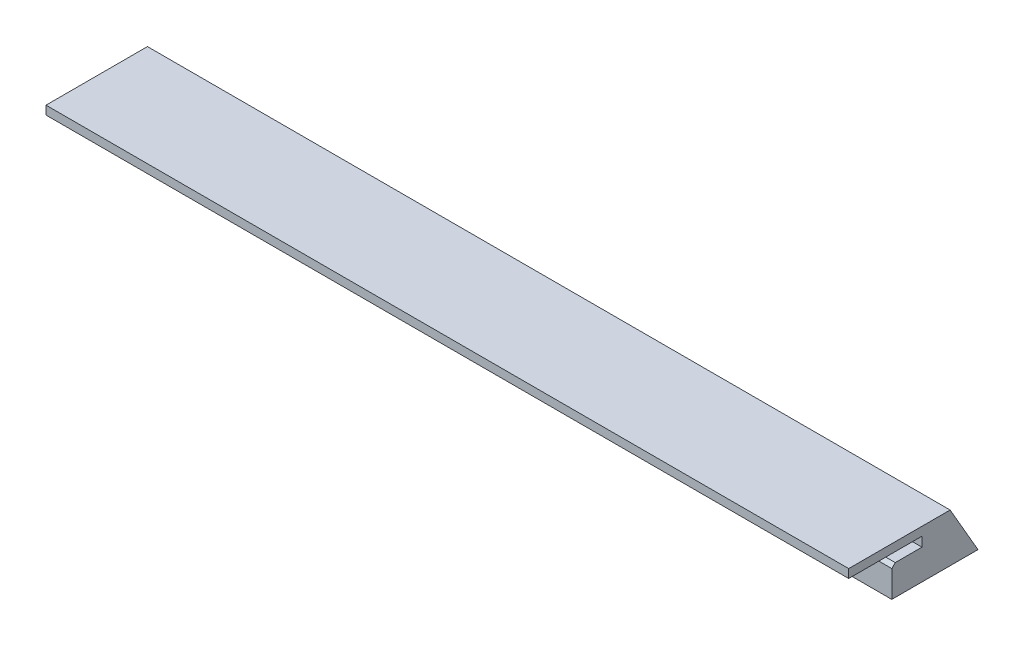
ISO-10303-21;
HEADER;
FILE_DESCRIPTION(('STEP AP214'),'2;1');
FILE_NAME('part.step','',(''),(''),'','','');
FILE_SCHEMA(('AUTOMOTIVE_DESIGN { 1 0 10303 214 1 1 1 1 }'));
ENDSEC;
DATA;
#1=APPLICATION_CONTEXT('core data for automotive mechanical design processes');
#2=APPLICATION_PROTOCOL_DEFINITION('international standard','automotive_design',2000,#1);
#3=PRODUCT_CONTEXT('',#1,'mechanical');
#4=PRODUCT('Part','Part','',(#3));
#5=PRODUCT_RELATED_PRODUCT_CATEGORY('part','',(#4));
#6=PRODUCT_DEFINITION_FORMATION('','',#4);
#7=PRODUCT_DEFINITION_CONTEXT('part definition',#1,'design');
#8=PRODUCT_DEFINITION('design','',#6,#7);
#9=PRODUCT_DEFINITION_SHAPE('','',#8);
#10=(LENGTH_UNIT() NAMED_UNIT(*) SI_UNIT(.MILLI.,.METRE.));
#11=(NAMED_UNIT(*) PLANE_ANGLE_UNIT() SI_UNIT($,.RADIAN.));
#12=(NAMED_UNIT(*) SI_UNIT($,.STERADIAN.) SOLID_ANGLE_UNIT());
#13=UNCERTAINTY_MEASURE_WITH_UNIT(LENGTH_MEASURE(1.E-05),#10,'distance_accuracy_value','');
#14=(GEOMETRIC_REPRESENTATION_CONTEXT(3) GLOBAL_UNCERTAINTY_ASSIGNED_CONTEXT((#13)) GLOBAL_UNIT_ASSIGNED_CONTEXT((#10,
#11,#12)) REPRESENTATION_CONTEXT('',''));
#15=CARTESIAN_POINT('',(0.,0.,0.));
#16=DIRECTION('',(0.,0.,1.));
#17=DIRECTION('',(1.,0.,0.));
#18=AXIS2_PLACEMENT_3D('',#15,#16,#17);
#19=CARTESIAN_POINT('',(0.,3.5,0.));
#20=DIRECTION('',(0.,0.,-1.));
#21=DIRECTION('',(-1.,0.,0.));
#22=AXIS2_PLACEMENT_3D('',#19,#20,#21);
#23=PLANE('',#22);
#24=DIRECTION('',(0.,-1.,0.));
#25=VECTOR('',#24,1.);
#26=CARTESIAN_POINT('',(88.1,4.6,0.));
#27=LINE('',#26,#25);
#28=CARTESIAN_POINT('',(88.1,4.6,0.));
#29=VERTEX_POINT('',#28);
#30=CARTESIAN_POINT('',(88.1,3.1,0.));
#31=VERTEX_POINT('',#30);
#32=EDGE_CURVE('E274',#29,#31,#27,.T.);
#33=ORIENTED_EDGE('',*,*,#32,.F.);
#34=DIRECTION('',(1.,0.,0.));
#35=VECTOR('',#34,1.);
#36=CARTESIAN_POINT('',(0.,4.6,0.));
#37=LINE('',#36,#35);
#38=CARTESIAN_POINT('',(76.399623113199,4.6,0.));
#39=VERTEX_POINT('',#38);
#40=EDGE_CURVE('E305',#39,#29,#37,.T.);
#41=ORIENTED_EDGE('',*,*,#40,.F.);
#42=DIRECTION('',(0.,-1.,0.));
#43=VECTOR('',#42,1.);
#44=CARTESIAN_POINT('',(76.399623113199,6.601,0.));
#45=LINE('',#44,#43);
#46=CARTESIAN_POINT('',(76.399623113199,0.,0.));
#47=VERTEX_POINT('',#46);
#48=EDGE_CURVE('E263',#47,#39,#45,.F.);
#49=ORIENTED_EDGE('',*,*,#48,.F.);
#50=DIRECTION('',(1.,0.,0.));
#51=VECTOR('',#50,1.);
#52=CARTESIAN_POINT('',(0.,0.,0.));
#53=LINE('',#52,#51);
#54=CARTESIAN_POINT('',(93.1,0.,0.));
#55=VERTEX_POINT('',#54);
#56=EDGE_CURVE('E212',#47,#55,#53,.T.);
#57=ORIENTED_EDGE('',*,*,#56,.T.);
#58=DIRECTION('',(0.,-1.,0.));
#59=VECTOR('',#58,1.);
#60=CARTESIAN_POINT('',(93.1,3.5,0.));
#61=LINE('',#60,#59);
#62=CARTESIAN_POINT('',(93.1,3.1,0.));
#63=VERTEX_POINT('',#62);
#64=EDGE_CURVE('E209',#63,#55,#61,.T.);
#65=ORIENTED_EDGE('',*,*,#64,.F.);
#66=DIRECTION('',(-1.,0.,0.));
#67=VECTOR('',#66,1.);
#68=CARTESIAN_POINT('',(0.,3.1,0.));
#69=LINE('',#68,#67);
#70=EDGE_CURVE('E224',#63,#31,#69,.T.);
#71=ORIENTED_EDGE('',*,*,#70,.T.);
#72=EDGE_LOOP('',(#33,#41,#49,#57,#65,#71));
#73=FACE_BOUND('',#72,.T.);
#74=ADVANCED_FACE('F41',(#73),#23,.F.);
#75=CARTESIAN_POINT('',(0.,3.5,0.));
#76=DIRECTION('',(0.,-1.,0.));
#77=DIRECTION('',(0.,0.,-1.));
#78=AXIS2_PLACEMENT_3D('',#75,#76,#77);
#79=PLANE('',#78);
#80=DIRECTION('',(0.,0.,-1.));
#81=VECTOR('',#80,1.);
#82=CARTESIAN_POINT('',(88.1,3.5,83.1072800661891));
#83=LINE('',#82,#81);
#84=CARTESIAN_POINT('',(88.1,3.5,-0.399999999999984));
#85=VERTEX_POINT('',#84);
#86=CARTESIAN_POINT('',(88.1,3.5,-3.5));
#87=VERTEX_POINT('',#86);
#88=EDGE_CURVE('E284',#85,#87,#83,.T.);
#89=ORIENTED_EDGE('',*,*,#88,.F.);
#90=DIRECTION('',(1.,0.,0.));
#91=VECTOR('',#90,1.);
#92=CARTESIAN_POINT('',(0.,3.5,-0.399999999999984));
#93=LINE('',#92,#91);
#94=CARTESIAN_POINT('',(93.1,3.5,-0.399999999999984));
#95=VERTEX_POINT('',#94);
#96=EDGE_CURVE('E231',#85,#95,#93,.T.);
#97=ORIENTED_EDGE('',*,*,#96,.T.);
#98=DIRECTION('',(0.,0.,-1.));
#99=VECTOR('',#98,1.);
#100=CARTESIAN_POINT('',(93.1,3.5,0.));
#101=LINE('',#100,#99);
#102=CARTESIAN_POINT('',(93.1,3.5,-3.5));
#103=VERTEX_POINT('',#102);
#104=EDGE_CURVE('E206',#95,#103,#101,.T.);
#105=ORIENTED_EDGE('',*,*,#104,.T.);
#106=DIRECTION('',(1.,0.,0.));
#107=VECTOR('',#106,1.);
#108=CARTESIAN_POINT('',(0.,3.5,-3.5));
#109=LINE('',#108,#107);
#110=EDGE_CURVE('E188',#87,#103,#109,.T.);
#111=ORIENTED_EDGE('',*,*,#110,.F.);
#112=EDGE_LOOP('',(#89,#97,#105,#111));
#113=FACE_BOUND('',#112,.T.);
#114=ADVANCED_FACE('F321',(#113),#79,.F.);
#115=DIRECTION('',(0.,0.,1.));
#116=VECTOR('',#115,1.);
#117=CARTESIAN_POINT('',(0.,3.5,0.));
#118=LINE('',#117,#116);
#119=CARTESIAN_POINT('',(0.,3.5,-3.5));
#120=VERTEX_POINT('',#119);
#121=CARTESIAN_POINT('',(0.,3.5,-0.399999999999984));
#122=VERTEX_POINT('',#121);
#123=EDGE_CURVE('E203',#120,#122,#118,.T.);
#124=ORIENTED_EDGE('',*,*,#123,.T.);
#125=DIRECTION('',(1.,0.,0.));
#126=VECTOR('',#125,1.);
#127=CARTESIAN_POINT('',(0.,3.5,-0.399999999999984));
#128=LINE('',#127,#126);
#129=CARTESIAN_POINT('',(5.,3.5,-0.399999999999984));
#130=VERTEX_POINT('',#129);
#131=EDGE_CURVE('E221',#122,#130,#128,.T.);
#132=ORIENTED_EDGE('',*,*,#131,.T.);
#133=DIRECTION('',(0.,0.,-1.));
#134=VECTOR('',#133,1.);
#135=CARTESIAN_POINT('',(5.,3.5,83.1072800661891));
#136=LINE('',#135,#134);
#137=CARTESIAN_POINT('',(5.,3.5,-3.5));
#138=VERTEX_POINT('',#137);
#139=EDGE_CURVE('E183',#130,#138,#136,.T.);
#140=ORIENTED_EDGE('',*,*,#139,.T.);
#141=EDGE_CURVE('E194',#120,#138,#109,.T.);
#142=ORIENTED_EDGE('',*,*,#141,.F.);
#143=EDGE_LOOP('',(#124,#132,#140,#142));
#144=FACE_BOUND('',#143,.T.);
#145=ADVANCED_FACE('F289',(#144),#79,.F.);
#146=CARTESIAN_POINT('',(0.,4.6,-3.5));
#147=DIRECTION('',(0.,0.,-1.));
#148=DIRECTION('',(-1.,0.,0.));
#149=AXIS2_PLACEMENT_3D('',#146,#147,#148);
#150=PLANE('',#149);
#151=DIRECTION('',(0.,1.,0.));
#152=VECTOR('',#151,1.);
#153=CARTESIAN_POINT('',(88.1,4.6,-3.5));
#154=LINE('',#153,#152);
#155=CARTESIAN_POINT('',(88.1,4.6,-3.5));
#156=VERTEX_POINT('',#155);
#157=EDGE_CURVE('E278',#87,#156,#154,.T.);
#158=ORIENTED_EDGE('',*,*,#157,.F.);
#159=ORIENTED_EDGE('',*,*,#110,.T.);
#160=DIRECTION('',(0.,-1.,0.));
#161=VECTOR('',#160,1.);
#162=CARTESIAN_POINT('',(93.1,4.6,-3.5));
#163=LINE('',#162,#161);
#164=CARTESIAN_POINT('',(93.1,4.6,-3.5));
#165=VERTEX_POINT('',#164);
#166=EDGE_CURVE('E192',#165,#103,#163,.T.);
#167=ORIENTED_EDGE('',*,*,#166,.F.);
#168=DIRECTION('',(1.,0.,0.));
#169=VECTOR('',#168,1.);
#170=CARTESIAN_POINT('',(0.,4.6,-3.5));
#171=LINE('',#170,#169);
#172=EDGE_CURVE('E193',#156,#165,#171,.T.);
#173=ORIENTED_EDGE('',*,*,#172,.F.);
#174=EDGE_LOOP('',(#158,#159,#167,#173));
#175=FACE_BOUND('',#174,.T.);
#176=ADVANCED_FACE('F326',(#175),#150,.F.);
#177=DIRECTION('',(0.,-1.,0.));
#178=VECTOR('',#177,1.);
#179=CARTESIAN_POINT('',(5.,4.6,-3.5));
#180=LINE('',#179,#178);
#181=CARTESIAN_POINT('',(5.,4.6,-3.5));
#182=VERTEX_POINT('',#181);
#183=EDGE_CURVE('E273',#182,#138,#180,.T.);
#184=ORIENTED_EDGE('',*,*,#183,.F.);
#185=CARTESIAN_POINT('',(0.,4.6,-3.5));
#186=VERTEX_POINT('',#185);
#187=EDGE_CURVE('E189',#186,#182,#171,.T.);
#188=ORIENTED_EDGE('',*,*,#187,.F.);
#189=DIRECTION('',(0.,-1.,0.));
#190=VECTOR('',#189,1.);
#191=CARTESIAN_POINT('',(0.,4.6,-3.5));
#192=LINE('',#191,#190);
#193=EDGE_CURVE('E199',#186,#120,#192,.T.);
#194=ORIENTED_EDGE('',*,*,#193,.T.);
#195=ORIENTED_EDGE('',*,*,#141,.T.);
#196=EDGE_LOOP('',(#184,#188,#194,#195));
#197=FACE_BOUND('',#196,.T.);
#198=ADVANCED_FACE('F292',(#197),#150,.F.);
#199=CARTESIAN_POINT('',(0.,4.6,0.));
#200=DIRECTION('',(0.,1.,0.));
#201=DIRECTION('',(0.,0.,1.));
#202=AXIS2_PLACEMENT_3D('',#199,#200,#201);
#203=PLANE('',#202);
#204=DIRECTION('',(0.,0.,-1.));
#205=VECTOR('',#204,1.);
#206=CARTESIAN_POINT('',(5.,4.6,83.1072800661891));
#207=LINE('',#206,#205);
#208=CARTESIAN_POINT('',(5.,4.6,0.));
#209=VERTEX_POINT('',#208);
#210=EDGE_CURVE('E280',#209,#182,#207,.T.);
#211=ORIENTED_EDGE('',*,*,#210,.F.);
#212=CARTESIAN_POINT('',(16.7003768868009,4.6,0.));
#213=VERTEX_POINT('',#212);
#214=EDGE_CURVE('E65',#209,#213,#37,.T.);
#215=ORIENTED_EDGE('',*,*,#214,.T.);
#216=CARTESIAN_POINT('',(46.55,4.6,147.));
#217=DIRECTION('',(0.,-1.,0.));
#218=DIRECTION('',(0.,0.,-1.));
#219=AXIS2_PLACEMENT_3D('',#216,#217,#218);
#220=CIRCLE('',#219,150.);
#221=EDGE_CURVE('E264',#213,#39,#220,.T.);
#222=ORIENTED_EDGE('',*,*,#221,.T.);
#223=ORIENTED_EDGE('',*,*,#40,.T.);
#224=DIRECTION('',(0.,0.,-1.));
#225=VECTOR('',#224,1.);
#226=CARTESIAN_POINT('',(88.1,4.6,83.1072800661891));
#227=LINE('',#226,#225);
#228=EDGE_CURVE('E282',#29,#156,#227,.T.);
#229=ORIENTED_EDGE('',*,*,#228,.T.);
#230=ORIENTED_EDGE('',*,*,#172,.T.);
#231=DIRECTION('',(0.,0.,-1.));
#232=VECTOR('',#231,1.);
#233=CARTESIAN_POINT('',(93.1,4.6,-10.));
#234=LINE('',#233,#232);
#235=CARTESIAN_POINT('',(93.1,4.6,5.));
#236=VERTEX_POINT('',#235);
#237=EDGE_CURVE('E178',#236,#165,#234,.T.);
#238=ORIENTED_EDGE('',*,*,#237,.F.);
#239=DIRECTION('',(1.,0.,0.));
#240=VECTOR('',#239,1.);
#241=CARTESIAN_POINT('',(0.,4.6,5.));
#242=LINE('',#241,#240);
#243=CARTESIAN_POINT('',(0.,4.6,5.));
#244=VERTEX_POINT('',#243);
#245=EDGE_CURVE('E298',#244,#236,#242,.T.);
#246=ORIENTED_EDGE('',*,*,#245,.F.);
#247=DIRECTION('',(0.,0.,1.));
#248=VECTOR('',#247,1.);
#249=CARTESIAN_POINT('',(0.,4.6,-10.));
#250=LINE('',#249,#248);
#251=EDGE_CURVE('E175',#186,#244,#250,.T.);
#252=ORIENTED_EDGE('',*,*,#251,.F.);
#253=ORIENTED_EDGE('',*,*,#187,.T.);
#254=EDGE_LOOP('',(#211,#215,#222,#223,#229,#230,#238,#246,#252,#253));
#255=FACE_BOUND('',#254,.T.);
#256=ADVANCED_FACE('F296',(#255),#203,.F.);
#257=CARTESIAN_POINT('',(0.,3.5,0.));
#258=DIRECTION('',(1.,0.,0.));
#259=DIRECTION('',(0.,0.,-1.));
#260=AXIS2_PLACEMENT_3D('',#257,#258,#259);
#261=PLANE('',#260);
#262=DIRECTION('',(0.,-1.,0.));
#263=VECTOR('',#262,1.);
#264=CARTESIAN_POINT('',(0.,4.6,5.));
#265=LINE('',#264,#263);
#266=CARTESIAN_POINT('',(0.,5.6,5.));
#267=VERTEX_POINT('',#266);
#268=EDGE_CURVE('E300',#267,#244,#265,.T.);
#269=ORIENTED_EDGE('',*,*,#268,.F.);
#270=DIRECTION('',(0.,0.,1.));
#271=VECTOR('',#270,1.);
#272=CARTESIAN_POINT('',(0.,5.6,5.));
#273=LINE('',#272,#271);
#274=CARTESIAN_POINT('',(0.,5.6,-6.7668384925381));
#275=VERTEX_POINT('',#274);
#276=EDGE_CURVE('E57',#275,#267,#273,.T.);
#277=ORIENTED_EDGE('',*,*,#276,.F.);
#278=DIRECTION('',(0.,0.866025403784442,0.499999999999995));
#279=VECTOR('',#278,1.);
#280=CARTESIAN_POINT('',(0.,0.,-10.));
#281=LINE('',#280,#279);
#282=CARTESIAN_POINT('',(0.,0.,-10.));
#283=VERTEX_POINT('',#282);
#284=EDGE_CURVE('E168',#283,#275,#281,.T.);
#285=ORIENTED_EDGE('',*,*,#284,.F.);
#286=DIRECTION('',(0.,0.,1.));
#287=VECTOR('',#286,1.);
#288=CARTESIAN_POINT('',(0.,0.,0.));
#289=LINE('',#288,#287);
#290=CARTESIAN_POINT('',(0.,0.,0.));
#291=VERTEX_POINT('',#290);
#292=EDGE_CURVE('E202',#283,#291,#289,.T.);
#293=ORIENTED_EDGE('',*,*,#292,.T.);
#294=DIRECTION('',(0.,-1.,0.));
#295=VECTOR('',#294,1.);
#296=CARTESIAN_POINT('',(0.,3.5,0.));
#297=LINE('',#296,#295);
#298=CARTESIAN_POINT('',(0.,3.1,0.));
#299=VERTEX_POINT('',#298);
#300=EDGE_CURVE('E219',#299,#291,#297,.T.);
#301=ORIENTED_EDGE('',*,*,#300,.F.);
#302=DIRECTION('',(0.,-0.70710678118656,0.707106781186535));
#303=VECTOR('',#302,1.);
#304=CARTESIAN_POINT('',(0.,3.5,-0.399999999999984));
#305=LINE('',#304,#303);
#306=EDGE_CURVE('E229',#299,#122,#305,.F.);
#307=ORIENTED_EDGE('',*,*,#306,.T.);
#308=ORIENTED_EDGE('',*,*,#123,.F.);
#309=ORIENTED_EDGE('',*,*,#193,.F.);
#310=ORIENTED_EDGE('',*,*,#251,.T.);
#311=EDGE_LOOP('',(#269,#277,#285,#293,#301,#307,#308,#309,#310));
#312=FACE_BOUND('',#311,.T.);
#313=ADVANCED_FACE('F253',(#312),#261,.F.);
#314=DIRECTION('',(0.,-1.,0.));
#315=VECTOR('',#314,1.);
#316=CARTESIAN_POINT('',(16.7003768868009,6.601,0.));
#317=LINE('',#316,#315);
#318=CARTESIAN_POINT('',(16.7003768868009,0.,0.));
#319=VERTEX_POINT('',#318);
#320=EDGE_CURVE('E261',#213,#319,#317,.T.);
#321=ORIENTED_EDGE('',*,*,#320,.F.);
#322=ORIENTED_EDGE('',*,*,#214,.F.);
#323=DIRECTION('',(0.,1.,0.));
#324=VECTOR('',#323,1.);
#325=CARTESIAN_POINT('',(5.,4.6,0.));
#326=LINE('',#325,#324);
#327=CARTESIAN_POINT('',(5.,3.1,0.));
#328=VERTEX_POINT('',#327);
#329=EDGE_CURVE('E180',#328,#209,#326,.T.);
#330=ORIENTED_EDGE('',*,*,#329,.F.);
#331=DIRECTION('',(-1.,0.,0.));
#332=VECTOR('',#331,1.);
#333=CARTESIAN_POINT('',(0.,3.1,0.));
#334=LINE('',#333,#332);
#335=EDGE_CURVE('E227',#328,#299,#334,.T.);
#336=ORIENTED_EDGE('',*,*,#335,.T.);
#337=ORIENTED_EDGE('',*,*,#300,.T.);
#338=EDGE_CURVE('E213',#291,#319,#53,.T.);
#339=ORIENTED_EDGE('',*,*,#338,.T.);
#340=EDGE_LOOP('',(#321,#322,#330,#336,#337,#339));
#341=FACE_BOUND('',#340,.T.);
#342=ADVANCED_FACE('F249',(#341),#23,.F.);
#343=CARTESIAN_POINT('',(93.1,3.5,0.));
#344=DIRECTION('',(-1.,0.,0.));
#345=DIRECTION('',(0.,0.,1.));
#346=AXIS2_PLACEMENT_3D('',#343,#344,#345);
#347=PLANE('',#346);
#348=DIRECTION('',(0.,0.866025403784442,0.499999999999995));
#349=VECTOR('',#348,1.);
#350=CARTESIAN_POINT('',(93.1,0.,-10.));
#351=LINE('',#350,#349);
#352=CARTESIAN_POINT('',(93.1,0.,-10.));
#353=VERTEX_POINT('',#352);
#354=CARTESIAN_POINT('',(93.1,5.6,-6.76683849253814));
#355=VERTEX_POINT('',#354);
#356=EDGE_CURVE('E165',#353,#355,#351,.T.);
#357=ORIENTED_EDGE('',*,*,#356,.T.);
#358=DIRECTION('',(0.,0.,-1.));
#359=VECTOR('',#358,1.);
#360=CARTESIAN_POINT('',(93.1,5.6,5.));
#361=LINE('',#360,#359);
#362=CARTESIAN_POINT('',(93.1,5.6,5.));
#363=VERTEX_POINT('',#362);
#364=EDGE_CURVE('E152',#363,#355,#361,.T.);
#365=ORIENTED_EDGE('',*,*,#364,.F.);
#366=DIRECTION('',(0.,1.,0.));
#367=VECTOR('',#366,1.);
#368=CARTESIAN_POINT('',(93.1,4.6,5.));
#369=LINE('',#368,#367);
#370=EDGE_CURVE('E268',#236,#363,#369,.T.);
#371=ORIENTED_EDGE('',*,*,#370,.F.);
#372=ORIENTED_EDGE('',*,*,#237,.T.);
#373=ORIENTED_EDGE('',*,*,#166,.T.);
#374=ORIENTED_EDGE('',*,*,#104,.F.);
#375=DIRECTION('',(0.,0.70710678118656,-0.707106781186535));
#376=VECTOR('',#375,1.);
#377=CARTESIAN_POINT('',(93.1,3.5,-0.399999999999984));
#378=LINE('',#377,#376);
#379=EDGE_CURVE('E234',#95,#63,#378,.F.);
#380=ORIENTED_EDGE('',*,*,#379,.T.);
#381=ORIENTED_EDGE('',*,*,#64,.T.);
#382=DIRECTION('',(0.,0.,-1.));
#383=VECTOR('',#382,1.);
#384=CARTESIAN_POINT('',(93.1,0.,0.));
#385=LINE('',#384,#383);
#386=EDGE_CURVE('E173',#55,#353,#385,.T.);
#387=ORIENTED_EDGE('',*,*,#386,.T.);
#388=EDGE_LOOP('',(#357,#365,#371,#372,#373,#374,#380,#381,#387));
#389=FACE_BOUND('',#388,.T.);
#390=ADVANCED_FACE('F170',(#389),#347,.F.);
#391=CARTESIAN_POINT('',(0.,0.,0.));
#392=DIRECTION('',(0.,-1.,0.));
#393=DIRECTION('',(0.,0.,-1.));
#394=AXIS2_PLACEMENT_3D('',#391,#392,#393);
#395=PLANE('',#394);
#396=CARTESIAN_POINT('',(46.55,0.,147.));
#397=DIRECTION('',(0.,-1.,0.));
#398=DIRECTION('',(0.,0.,-1.));
#399=AXIS2_PLACEMENT_3D('',#396,#397,#398);
#400=CIRCLE('',#399,150.);
#401=EDGE_CURVE('E260',#319,#47,#400,.T.);
#402=ORIENTED_EDGE('',*,*,#401,.F.);
#403=ORIENTED_EDGE('',*,*,#338,.F.);
#404=ORIENTED_EDGE('',*,*,#292,.F.);
#405=DIRECTION('',(-1.,0.,0.));
#406=VECTOR('',#405,1.);
#407=CARTESIAN_POINT('',(0.,0.,-10.));
#408=LINE('',#407,#406);
#409=EDGE_CURVE('E207',#353,#283,#408,.T.);
#410=ORIENTED_EDGE('',*,*,#409,.F.);
#411=ORIENTED_EDGE('',*,*,#386,.F.);
#412=ORIENTED_EDGE('',*,*,#56,.F.);
#413=EDGE_LOOP('',(#402,#403,#404,#410,#411,#412));
#414=FACE_BOUND('',#413,.T.);
#415=ADVANCED_FACE('F258',(#414),#395,.T.);
#416=CARTESIAN_POINT('',(93.1,0.,-10.));
#417=DIRECTION('',(0.,-0.499999999999995,0.866025403784442));
#418=DIRECTION('',(0.,-0.866025403784442,-0.499999999999995));
#419=AXIS2_PLACEMENT_3D('',#416,#417,#418);
#420=PLANE('',#419);
#421=ORIENTED_EDGE('',*,*,#284,.T.);
#422=DIRECTION('',(-1.,0.,0.));
#423=VECTOR('',#422,1.);
#424=CARTESIAN_POINT('',(-0.001000000000001,5.6,-6.76683849253814));
#425=LINE('',#424,#423);
#426=EDGE_CURVE('E155',#355,#275,#425,.T.);
#427=ORIENTED_EDGE('',*,*,#426,.F.);
#428=ORIENTED_EDGE('',*,*,#356,.F.);
#429=ORIENTED_EDGE('',*,*,#409,.T.);
#430=EDGE_LOOP('',(#421,#427,#428,#429));
#431=FACE_BOUND('',#430,.T.);
#432=ADVANCED_FACE('F164',(#431),#420,.F.);
#433=CARTESIAN_POINT('',(88.1,4.6,83.1072800661891));
#434=DIRECTION('',(-1.,0.,0.));
#435=DIRECTION('',(0.,0.,1.));
#436=AXIS2_PLACEMENT_3D('',#433,#434,#435);
#437=PLANE('',#436);
#438=ORIENTED_EDGE('',*,*,#228,.F.);
#439=ORIENTED_EDGE('',*,*,#32,.T.);
#440=DIRECTION('',(0.,-0.70710678118656,0.707106781186535));
#441=VECTOR('',#440,1.);
#442=CARTESIAN_POINT('',(88.1,-37.7036400330945,40.8036400330931));
#443=LINE('',#442,#441);
#444=EDGE_CURVE('E11',#31,#85,#443,.F.);
#445=ORIENTED_EDGE('',*,*,#444,.T.);
#446=ORIENTED_EDGE('',*,*,#88,.T.);
#447=ORIENTED_EDGE('',*,*,#157,.T.);
#448=EDGE_LOOP('',(#438,#439,#445,#446,#447));
#449=FACE_BOUND('',#448,.T.);
#450=ADVANCED_FACE('F313',(#449),#437,.F.);
#451=CARTESIAN_POINT('',(5.,4.6,83.1072800661891));
#452=DIRECTION('',(1.,0.,0.));
#453=DIRECTION('',(0.,0.,-1.));
#454=AXIS2_PLACEMENT_3D('',#451,#452,#453);
#455=PLANE('',#454);
#456=ORIENTED_EDGE('',*,*,#139,.F.);
#457=DIRECTION('',(0.,0.70710678118656,-0.707106781186535));
#458=VECTOR('',#457,1.);
#459=CARTESIAN_POINT('',(5.,-37.7036400330945,40.8036400330931));
#460=LINE('',#459,#458);
#461=EDGE_CURVE('E50',#130,#328,#460,.F.);
#462=ORIENTED_EDGE('',*,*,#461,.T.);
#463=ORIENTED_EDGE('',*,*,#329,.T.);
#464=ORIENTED_EDGE('',*,*,#210,.T.);
#465=ORIENTED_EDGE('',*,*,#183,.T.);
#466=EDGE_LOOP('',(#456,#462,#463,#464,#465));
#467=FACE_BOUND('',#466,.T.);
#468=ADVANCED_FACE('F240',(#467),#455,.F.);
#469=CARTESIAN_POINT('',(0.,3.5,-0.399999999999984));
#470=DIRECTION('',(0.,-0.707106781186535,-0.70710678118656));
#471=DIRECTION('',(1.,0.,0.));
#472=AXIS2_PLACEMENT_3D('',#469,#470,#471);
#473=PLANE('',#472);
#474=ORIENTED_EDGE('',*,*,#306,.F.);
#475=ORIENTED_EDGE('',*,*,#335,.F.);
#476=ORIENTED_EDGE('',*,*,#461,.F.);
#477=ORIENTED_EDGE('',*,*,#131,.F.);
#478=EDGE_LOOP('',(#474,#475,#476,#477));
#479=FACE_BOUND('',#478,.T.);
#480=ADVANCED_FACE('F245',(#479),#473,.F.);
#481=CARTESIAN_POINT('',(0.,3.5,-0.399999999999984));
#482=DIRECTION('',(0.,-0.707106781186535,-0.70710678118656));
#483=DIRECTION('',(1.,0.,0.));
#484=AXIS2_PLACEMENT_3D('',#481,#482,#483);
#485=PLANE('',#484);
#486=ORIENTED_EDGE('',*,*,#444,.F.);
#487=ORIENTED_EDGE('',*,*,#70,.F.);
#488=ORIENTED_EDGE('',*,*,#379,.F.);
#489=ORIENTED_EDGE('',*,*,#96,.F.);
#490=EDGE_LOOP('',(#486,#487,#488,#489));
#491=FACE_BOUND('',#490,.T.);
#492=ADVANCED_FACE('F44',(#491),#485,.F.);
#493=CARTESIAN_POINT('',(46.55,6.601,147.));
#494=DIRECTION('',(0.,-1.,0.));
#495=DIRECTION('',(0.,0.,-1.));
#496=AXIS2_PLACEMENT_3D('',#493,#494,#495);
#497=CYLINDRICAL_SURFACE('',#496,150.);
#498=ORIENTED_EDGE('',*,*,#48,.T.);
#499=ORIENTED_EDGE('',*,*,#221,.F.);
#500=ORIENTED_EDGE('',*,*,#320,.T.);
#501=ORIENTED_EDGE('',*,*,#401,.T.);
#502=EDGE_LOOP('',(#498,#499,#500,#501));
#503=FACE_BOUND('',#502,.T.);
#504=ADVANCED_FACE('F329',(#503),#497,.F.);
#505=CARTESIAN_POINT('',(0.,0.,5.));
#506=DIRECTION('',(0.,0.,-1.));
#507=DIRECTION('',(-1.,0.,0.));
#508=AXIS2_PLACEMENT_3D('',#505,#506,#507);
#509=PLANE('',#508);
#510=ORIENTED_EDGE('',*,*,#370,.T.);
#511=DIRECTION('',(1.,0.,0.));
#512=VECTOR('',#511,1.);
#513=CARTESIAN_POINT('',(-0.001000000000001,5.6,5.));
#514=LINE('',#513,#512);
#515=EDGE_CURVE('E156',#267,#363,#514,.T.);
#516=ORIENTED_EDGE('',*,*,#515,.F.);
#517=ORIENTED_EDGE('',*,*,#268,.T.);
#518=ORIENTED_EDGE('',*,*,#245,.T.);
#519=EDGE_LOOP('',(#510,#516,#517,#518));
#520=FACE_BOUND('',#519,.T.);
#521=ADVANCED_FACE('F327',(#520),#509,.F.);
#522=CARTESIAN_POINT('',(-0.001000000000001,5.6,5.));
#523=DIRECTION('',(0.,-1.,0.));
#524=DIRECTION('',(0.,0.,-1.));
#525=AXIS2_PLACEMENT_3D('',#522,#523,#524);
#526=PLANE('',#525);
#527=ORIENTED_EDGE('',*,*,#276,.T.);
#528=ORIENTED_EDGE('',*,*,#515,.T.);
#529=ORIENTED_EDGE('',*,*,#364,.T.);
#530=ORIENTED_EDGE('',*,*,#426,.T.);
#531=EDGE_LOOP('',(#527,#528,#529,#530));
#532=FACE_BOUND('',#531,.T.);
#533=ADVANCED_FACE('F154',(#532),#526,.F.);
#534=CLOSED_SHELL('',(#74,#114,#145,#176,#198,#256,#313,#342,#390,#415,#432,#450,#468,#480,#492,
#504,#521,#533));
#535=MANIFOLD_SOLID_BREP('B2',#534);
#536=ADVANCED_BREP_SHAPE_REPRESENTATION('',(#18,#535),#14);
#537=SHAPE_DEFINITION_REPRESENTATION(#9,#536);
ENDSEC;
END-ISO-10303-21;
